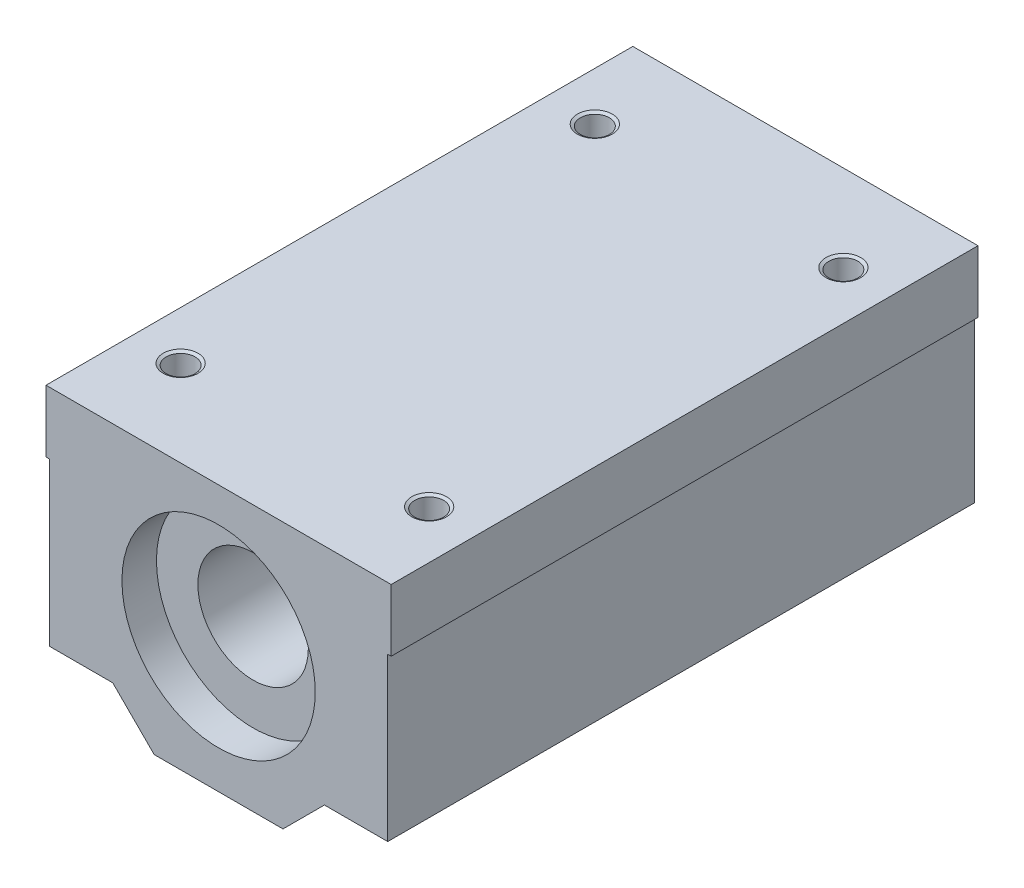
ISO-10303-21;
HEADER;
FILE_DESCRIPTION(('STEP AP214'),'2;1');
FILE_NAME('part.step','',(''),(''),'','','');
FILE_SCHEMA(('AUTOMOTIVE_DESIGN { 1 0 10303 214 1 1 1 1 }'));
ENDSEC;
DATA;
#1=APPLICATION_CONTEXT('core data for automotive mechanical design processes');
#2=APPLICATION_PROTOCOL_DEFINITION('international standard','automotive_design',2000,#1);
#3=PRODUCT_CONTEXT('',#1,'mechanical');
#4=PRODUCT('Part','Part','',(#3));
#5=PRODUCT_RELATED_PRODUCT_CATEGORY('part','',(#4));
#6=PRODUCT_DEFINITION_FORMATION('','',#4);
#7=PRODUCT_DEFINITION_CONTEXT('part definition',#1,'design');
#8=PRODUCT_DEFINITION('design','',#6,#7);
#9=PRODUCT_DEFINITION_SHAPE('','',#8);
#10=(LENGTH_UNIT() NAMED_UNIT(*) SI_UNIT(.MILLI.,.METRE.));
#11=(NAMED_UNIT(*) PLANE_ANGLE_UNIT() SI_UNIT($,.RADIAN.));
#12=(NAMED_UNIT(*) SI_UNIT($,.STERADIAN.) SOLID_ANGLE_UNIT());
#13=UNCERTAINTY_MEASURE_WITH_UNIT(LENGTH_MEASURE(1.E-05),#10,'distance_accuracy_value','');
#14=(GEOMETRIC_REPRESENTATION_CONTEXT(3) GLOBAL_UNCERTAINTY_ASSIGNED_CONTEXT((#13)) GLOBAL_UNIT_ASSIGNED_CONTEXT((#10,
#11,#12)) REPRESENTATION_CONTEXT('',''));
#15=CARTESIAN_POINT('',(0.,0.,0.));
#16=DIRECTION('',(0.,0.,1.));
#17=DIRECTION('',(1.,0.,0.));
#18=AXIS2_PLACEMENT_3D('',#15,#16,#17);
#19=CARTESIAN_POINT('',(0.,0.,85.));
#20=DIRECTION('',(0.,0.,-1.));
#21=DIRECTION('',(-1.,0.,0.));
#22=AXIS2_PLACEMENT_3D('',#19,#20,#21);
#23=CYLINDRICAL_SURFACE('',#22,8.);
#24=CARTESIAN_POINT('',(0.,0.,5.));
#25=DIRECTION('',(0.,0.,-1.));
#26=DIRECTION('',(-1.,0.,0.));
#27=AXIS2_PLACEMENT_3D('',#24,#25,#26);
#28=CIRCLE('',#27,8.);
#29=CARTESIAN_POINT('',(-8.,0.,5.));
#30=VERTEX_POINT('',#29);
#31=EDGE_CURVE('E227',#30,#30,#28,.T.);
#32=ORIENTED_EDGE('',*,*,#31,.T.);
#33=EDGE_LOOP('',(#32));
#34=FACE_BOUND('',#33,.T.);
#35=CARTESIAN_POINT('',(0.,0.,80.));
#36=DIRECTION('',(0.,0.,1.));
#37=DIRECTION('',(1.,0.,0.));
#38=AXIS2_PLACEMENT_3D('',#35,#36,#37);
#39=CIRCLE('',#38,8.);
#40=CARTESIAN_POINT('',(8.,0.,80.));
#41=VERTEX_POINT('',#40);
#42=EDGE_CURVE('E42',#41,#41,#39,.T.);
#43=ORIENTED_EDGE('',*,*,#42,.T.);
#44=EDGE_LOOP('',(#43));
#45=FACE_BOUND('',#44,.T.);
#46=ADVANCED_FACE('F38',(#34,#45),#23,.F.);
#47=CARTESIAN_POINT('',(-18.,19.,12.5));
#48=DIRECTION('',(0.,1.,0.));
#49=DIRECTION('',(0.,0.,1.));
#50=AXIS2_PLACEMENT_3D('',#47,#48,#49);
#51=CYLINDRICAL_SURFACE('',#50,2.1);
#52=CARTESIAN_POINT('',(-18.,18.7546261355944,12.5));
#53=DIRECTION('',(0.,1.,0.));
#54=DIRECTION('',(0.,0.,1.));
#55=AXIS2_PLACEMENT_3D('',#52,#53,#54);
#56=CIRCLE('',#55,2.1);
#57=CARTESIAN_POINT('',(-18.,18.7546261355944,14.6));
#58=VERTEX_POINT('',#57);
#59=EDGE_CURVE('E165',#58,#58,#56,.T.);
#60=ORIENTED_EDGE('',*,*,#59,.T.);
#61=EDGE_LOOP('',(#60));
#62=FACE_BOUND('',#61,.T.);
#63=CARTESIAN_POINT('',(-18.,10.5,12.5));
#64=DIRECTION('',(0.,-1.,0.));
#65=DIRECTION('',(0.,0.,-1.));
#66=AXIS2_PLACEMENT_3D('',#63,#64,#65);
#67=CIRCLE('',#66,2.1);
#68=CARTESIAN_POINT('',(-18.,10.5,10.4));
#69=VERTEX_POINT('',#68);
#70=EDGE_CURVE('E223',#69,#69,#67,.F.);
#71=ORIENTED_EDGE('',*,*,#70,.F.);
#72=EDGE_LOOP('',(#71));
#73=FACE_BOUND('',#72,.T.);
#74=ADVANCED_FACE('F329',(#62,#73),#51,.F.);
#75=CARTESIAN_POINT('',(18.,19.,12.5));
#76=DIRECTION('',(0.,1.,0.));
#77=DIRECTION('',(0.,0.,1.));
#78=AXIS2_PLACEMENT_3D('',#75,#76,#77);
#79=CYLINDRICAL_SURFACE('',#78,2.1);
#80=CARTESIAN_POINT('',(18.,18.7546261355944,12.5));
#81=DIRECTION('',(0.,1.,0.));
#82=DIRECTION('',(0.,0.,1.));
#83=AXIS2_PLACEMENT_3D('',#80,#81,#82);
#84=CIRCLE('',#83,2.1);
#85=CARTESIAN_POINT('',(18.,18.7546261355944,14.6));
#86=VERTEX_POINT('',#85);
#87=EDGE_CURVE('E262',#86,#86,#84,.T.);
#88=ORIENTED_EDGE('',*,*,#87,.T.);
#89=EDGE_LOOP('',(#88));
#90=FACE_BOUND('',#89,.T.);
#91=CARTESIAN_POINT('',(18.,10.5,12.5));
#92=DIRECTION('',(0.,-1.,0.));
#93=DIRECTION('',(0.,0.,-1.));
#94=AXIS2_PLACEMENT_3D('',#91,#92,#93);
#95=CIRCLE('',#94,2.1);
#96=CARTESIAN_POINT('',(18.,10.5,10.4));
#97=VERTEX_POINT('',#96);
#98=EDGE_CURVE('E218',#97,#97,#95,.F.);
#99=ORIENTED_EDGE('',*,*,#98,.F.);
#100=EDGE_LOOP('',(#99));
#101=FACE_BOUND('',#100,.T.);
#102=ADVANCED_FACE('F334',(#90,#101),#79,.F.);
#103=CARTESIAN_POINT('',(18.,19.,72.5));
#104=DIRECTION('',(0.,1.,0.));
#105=DIRECTION('',(0.,0.,1.));
#106=AXIS2_PLACEMENT_3D('',#103,#104,#105);
#107=CYLINDRICAL_SURFACE('',#106,2.1);
#108=CARTESIAN_POINT('',(18.,18.7546261355944,72.5));
#109=DIRECTION('',(0.,1.,0.));
#110=DIRECTION('',(0.,0.,1.));
#111=AXIS2_PLACEMENT_3D('',#108,#109,#110);
#112=CIRCLE('',#111,2.1);
#113=CARTESIAN_POINT('',(18.,18.7546261355944,74.6));
#114=VERTEX_POINT('',#113);
#115=EDGE_CURVE('E268',#114,#114,#112,.T.);
#116=ORIENTED_EDGE('',*,*,#115,.T.);
#117=EDGE_LOOP('',(#116));
#118=FACE_BOUND('',#117,.T.);
#119=CARTESIAN_POINT('',(18.,10.5,72.5));
#120=DIRECTION('',(0.,-1.,0.));
#121=DIRECTION('',(0.,0.,-1.));
#122=AXIS2_PLACEMENT_3D('',#119,#120,#121);
#123=CIRCLE('',#122,2.1);
#124=CARTESIAN_POINT('',(18.,10.5,70.4));
#125=VERTEX_POINT('',#124);
#126=EDGE_CURVE('E213',#125,#125,#123,.F.);
#127=ORIENTED_EDGE('',*,*,#126,.F.);
#128=EDGE_LOOP('',(#127));
#129=FACE_BOUND('',#128,.T.);
#130=ADVANCED_FACE('F402',(#118,#129),#107,.F.);
#131=CARTESIAN_POINT('',(-18.,19.,72.5));
#132=DIRECTION('',(0.,1.,0.));
#133=DIRECTION('',(0.,0.,1.));
#134=AXIS2_PLACEMENT_3D('',#131,#132,#133);
#135=CYLINDRICAL_SURFACE('',#134,2.1);
#136=CARTESIAN_POINT('',(-18.,18.7546261355944,72.5));
#137=DIRECTION('',(0.,1.,0.));
#138=DIRECTION('',(0.,0.,1.));
#139=AXIS2_PLACEMENT_3D('',#136,#137,#138);
#140=CIRCLE('',#139,2.1);
#141=CARTESIAN_POINT('',(-18.,18.7546261355944,74.6));
#142=VERTEX_POINT('',#141);
#143=EDGE_CURVE('E274',#142,#142,#140,.T.);
#144=ORIENTED_EDGE('',*,*,#143,.T.);
#145=EDGE_LOOP('',(#144));
#146=FACE_BOUND('',#145,.T.);
#147=CARTESIAN_POINT('',(-18.,10.5,72.5));
#148=DIRECTION('',(0.,-1.,0.));
#149=DIRECTION('',(0.,0.,-1.));
#150=AXIS2_PLACEMENT_3D('',#147,#148,#149);
#151=CIRCLE('',#150,2.1);
#152=CARTESIAN_POINT('',(-18.,10.5,70.4));
#153=VERTEX_POINT('',#152);
#154=EDGE_CURVE('E208',#153,#153,#151,.F.);
#155=ORIENTED_EDGE('',*,*,#154,.F.);
#156=EDGE_LOOP('',(#155));
#157=FACE_BOUND('',#156,.T.);
#158=ADVANCED_FACE('F340',(#146,#157),#135,.F.);
#159=CARTESIAN_POINT('',(0.,-28.8296389995692,85.));
#160=DIRECTION('',(0.,0.,-1.));
#161=DIRECTION('',(-1.,0.,0.));
#162=AXIS2_PLACEMENT_3D('',#159,#160,#161);
#163=PLANE('',#162);
#164=CARTESIAN_POINT('',(0.,0.,85.));
#165=DIRECTION('',(0.,0.,1.));
#166=DIRECTION('',(1.,0.,0.));
#167=AXIS2_PLACEMENT_3D('',#164,#165,#166);
#168=CIRCLE('',#167,14.);
#169=CARTESIAN_POINT('',(14.,0.,85.));
#170=VERTEX_POINT('',#169);
#171=EDGE_CURVE('E243',#170,#170,#168,.T.);
#172=ORIENTED_EDGE('',*,*,#171,.F.);
#173=EDGE_LOOP('',(#172));
#174=FACE_BOUND('',#173,.T.);
#175=DIRECTION('',(0.707106781186546,-0.707106781186549,0.));
#176=VECTOR('',#175,1.);
#177=CARTESIAN_POINT('',(-15.3296389995691,-13.5,85.));
#178=LINE('',#177,#176);
#179=CARTESIAN_POINT('',(-15.3296389995691,-13.5,85.));
#180=VERTEX_POINT('',#179);
#181=CARTESIAN_POINT('',(-9.32963899956915,-19.5,85.));
#182=VERTEX_POINT('',#181);
#183=EDGE_CURVE('E184',#180,#182,#178,.T.);
#184=ORIENTED_EDGE('',*,*,#183,.T.);
#185=DIRECTION('',(1.,0.,0.));
#186=VECTOR('',#185,1.);
#187=CARTESIAN_POINT('',(9.32963899956915,-19.5,85.));
#188=LINE('',#187,#186);
#189=CARTESIAN_POINT('',(9.32963899956915,-19.5,85.));
#190=VERTEX_POINT('',#189);
#191=EDGE_CURVE('E112',#182,#190,#188,.T.);
#192=ORIENTED_EDGE('',*,*,#191,.T.);
#193=DIRECTION('',(0.707106781186546,0.707106781186549,0.));
#194=VECTOR('',#193,1.);
#195=CARTESIAN_POINT('',(15.3296389995691,-13.5,85.));
#196=LINE('',#195,#194);
#197=CARTESIAN_POINT('',(15.3296389995691,-13.5,85.));
#198=VERTEX_POINT('',#197);
#199=EDGE_CURVE('E284',#190,#198,#196,.T.);
#200=ORIENTED_EDGE('',*,*,#199,.T.);
#201=DIRECTION('',(1.,0.,0.));
#202=VECTOR('',#201,1.);
#203=CARTESIAN_POINT('',(24.5,-13.5,85.));
#204=LINE('',#203,#202);
#205=CARTESIAN_POINT('',(24.5,-13.5,85.));
#206=VERTEX_POINT('',#205);
#207=EDGE_CURVE('E286',#198,#206,#204,.T.);
#208=ORIENTED_EDGE('',*,*,#207,.T.);
#209=DIRECTION('',(0.,1.,0.));
#210=VECTOR('',#209,1.);
#211=CARTESIAN_POINT('',(24.5,10.,85.));
#212=LINE('',#211,#210);
#213=CARTESIAN_POINT('',(24.5,10.,85.));
#214=VERTEX_POINT('',#213);
#215=EDGE_CURVE('E288',#206,#214,#212,.T.);
#216=ORIENTED_EDGE('',*,*,#215,.T.);
#217=DIRECTION('',(1.,0.,0.));
#218=VECTOR('',#217,1.);
#219=CARTESIAN_POINT('',(25.,10.,85.));
#220=LINE('',#219,#218);
#221=CARTESIAN_POINT('',(25.,10.,85.));
#222=VERTEX_POINT('',#221);
#223=EDGE_CURVE('E290',#214,#222,#220,.T.);
#224=ORIENTED_EDGE('',*,*,#223,.T.);
#225=DIRECTION('',(0.,1.,0.));
#226=VECTOR('',#225,1.);
#227=CARTESIAN_POINT('',(25.,19.,85.));
#228=LINE('',#227,#226);
#229=CARTESIAN_POINT('',(25.,19.,85.));
#230=VERTEX_POINT('',#229);
#231=EDGE_CURVE('E292',#222,#230,#228,.T.);
#232=ORIENTED_EDGE('',*,*,#231,.T.);
#233=DIRECTION('',(-1.,0.,0.));
#234=VECTOR('',#233,1.);
#235=CARTESIAN_POINT('',(-25.,19.,85.));
#236=LINE('',#235,#234);
#237=CARTESIAN_POINT('',(-25.,19.,85.));
#238=VERTEX_POINT('',#237);
#239=EDGE_CURVE('E294',#230,#238,#236,.T.);
#240=ORIENTED_EDGE('',*,*,#239,.T.);
#241=DIRECTION('',(0.,-1.,0.));
#242=VECTOR('',#241,1.);
#243=CARTESIAN_POINT('',(-25.,19.,85.));
#244=LINE('',#243,#242);
#245=CARTESIAN_POINT('',(-25.,10.,85.));
#246=VERTEX_POINT('',#245);
#247=EDGE_CURVE('E143',#238,#246,#244,.T.);
#248=ORIENTED_EDGE('',*,*,#247,.T.);
#249=DIRECTION('',(1.,0.,0.));
#250=VECTOR('',#249,1.);
#251=CARTESIAN_POINT('',(-25.,10.,85.));
#252=LINE('',#251,#250);
#253=CARTESIAN_POINT('',(-24.5,10.,85.));
#254=VERTEX_POINT('',#253);
#255=EDGE_CURVE('E137',#246,#254,#252,.T.);
#256=ORIENTED_EDGE('',*,*,#255,.T.);
#257=DIRECTION('',(0.,-1.,0.));
#258=VECTOR('',#257,1.);
#259=CARTESIAN_POINT('',(-24.5,10.,85.));
#260=LINE('',#259,#258);
#261=CARTESIAN_POINT('',(-24.5,-13.5,85.));
#262=VERTEX_POINT('',#261);
#263=EDGE_CURVE('E141',#254,#262,#260,.T.);
#264=ORIENTED_EDGE('',*,*,#263,.T.);
#265=DIRECTION('',(1.,0.,0.));
#266=VECTOR('',#265,1.);
#267=CARTESIAN_POINT('',(-24.5,-13.5,85.));
#268=LINE('',#267,#266);
#269=EDGE_CURVE('E57',#262,#180,#268,.T.);
#270=ORIENTED_EDGE('',*,*,#269,.T.);
#271=EDGE_LOOP('',(#184,#192,#200,#208,#216,#224,#232,#240,#248,#256,#264,#270));
#272=FACE_BOUND('',#271,.T.);
#273=ADVANCED_FACE('F139',(#174,#272),#163,.F.);
#274=CARTESIAN_POINT('',(0.,-28.8296389995692,0.));
#275=DIRECTION('',(0.,0.,-1.));
#276=DIRECTION('',(-1.,0.,0.));
#277=AXIS2_PLACEMENT_3D('',#274,#275,#276);
#278=PLANE('',#277);
#279=CARTESIAN_POINT('',(0.,0.,0.));
#280=DIRECTION('',(0.,0.,-1.));
#281=DIRECTION('',(-1.,0.,0.));
#282=AXIS2_PLACEMENT_3D('',#279,#280,#281);
#283=CIRCLE('',#282,14.);
#284=CARTESIAN_POINT('',(-14.,0.,0.));
#285=VERTEX_POINT('',#284);
#286=EDGE_CURVE('E236',#285,#285,#283,.T.);
#287=ORIENTED_EDGE('',*,*,#286,.F.);
#288=EDGE_LOOP('',(#287));
#289=FACE_BOUND('',#288,.T.);
#290=DIRECTION('',(0.707106781186546,-0.707106781186549,0.));
#291=VECTOR('',#290,1.);
#292=CARTESIAN_POINT('',(-15.3296389995691,-13.5,0.));
#293=LINE('',#292,#291);
#294=CARTESIAN_POINT('',(-15.3296389995691,-13.5,0.));
#295=VERTEX_POINT('',#294);
#296=CARTESIAN_POINT('',(-9.32963899956915,-19.5,0.));
#297=VERTEX_POINT('',#296);
#298=EDGE_CURVE('E161',#295,#297,#293,.T.);
#299=ORIENTED_EDGE('',*,*,#298,.F.);
#300=DIRECTION('',(1.,0.,0.));
#301=VECTOR('',#300,1.);
#302=CARTESIAN_POINT('',(-24.5,-13.5,0.));
#303=LINE('',#302,#301);
#304=CARTESIAN_POINT('',(-24.5,-13.5,0.));
#305=VERTEX_POINT('',#304);
#306=EDGE_CURVE('E104',#305,#295,#303,.T.);
#307=ORIENTED_EDGE('',*,*,#306,.F.);
#308=DIRECTION('',(0.,-1.,0.));
#309=VECTOR('',#308,1.);
#310=CARTESIAN_POINT('',(-24.5,10.,0.));
#311=LINE('',#310,#309);
#312=CARTESIAN_POINT('',(-24.5,10.,0.));
#313=VERTEX_POINT('',#312);
#314=EDGE_CURVE('E98',#313,#305,#311,.T.);
#315=ORIENTED_EDGE('',*,*,#314,.F.);
#316=DIRECTION('',(1.,0.,0.));
#317=VECTOR('',#316,1.);
#318=CARTESIAN_POINT('',(-25.,10.,0.));
#319=LINE('',#318,#317);
#320=CARTESIAN_POINT('',(-25.,10.,0.));
#321=VERTEX_POINT('',#320);
#322=EDGE_CURVE('E151',#321,#313,#319,.T.);
#323=ORIENTED_EDGE('',*,*,#322,.F.);
#324=DIRECTION('',(0.,-1.,0.));
#325=VECTOR('',#324,1.);
#326=CARTESIAN_POINT('',(-25.,19.,0.));
#327=LINE('',#326,#325);
#328=CARTESIAN_POINT('',(-25.,19.,0.));
#329=VERTEX_POINT('',#328);
#330=EDGE_CURVE('E179',#329,#321,#327,.T.);
#331=ORIENTED_EDGE('',*,*,#330,.F.);
#332=DIRECTION('',(-1.,0.,0.));
#333=VECTOR('',#332,1.);
#334=CARTESIAN_POINT('',(-25.,19.,0.));
#335=LINE('',#334,#333);
#336=CARTESIAN_POINT('',(25.,19.,0.));
#337=VERTEX_POINT('',#336);
#338=EDGE_CURVE('E177',#337,#329,#335,.T.);
#339=ORIENTED_EDGE('',*,*,#338,.F.);
#340=DIRECTION('',(0.,1.,0.));
#341=VECTOR('',#340,1.);
#342=CARTESIAN_POINT('',(25.,19.,0.));
#343=LINE('',#342,#341);
#344=CARTESIAN_POINT('',(25.,10.,0.));
#345=VERTEX_POINT('',#344);
#346=EDGE_CURVE('E175',#345,#337,#343,.T.);
#347=ORIENTED_EDGE('',*,*,#346,.F.);
#348=DIRECTION('',(1.,0.,0.));
#349=VECTOR('',#348,1.);
#350=CARTESIAN_POINT('',(25.,10.,0.));
#351=LINE('',#350,#349);
#352=CARTESIAN_POINT('',(24.5,10.,0.));
#353=VERTEX_POINT('',#352);
#354=EDGE_CURVE('E173',#353,#345,#351,.T.);
#355=ORIENTED_EDGE('',*,*,#354,.F.);
#356=DIRECTION('',(0.,1.,0.));
#357=VECTOR('',#356,1.);
#358=CARTESIAN_POINT('',(24.5,10.,0.));
#359=LINE('',#358,#357);
#360=CARTESIAN_POINT('',(24.5,-13.5,0.));
#361=VERTEX_POINT('',#360);
#362=EDGE_CURVE('E171',#361,#353,#359,.T.);
#363=ORIENTED_EDGE('',*,*,#362,.F.);
#364=DIRECTION('',(1.,0.,0.));
#365=VECTOR('',#364,1.);
#366=CARTESIAN_POINT('',(24.5,-13.5,0.));
#367=LINE('',#366,#365);
#368=CARTESIAN_POINT('',(15.3296389995691,-13.5,0.));
#369=VERTEX_POINT('',#368);
#370=EDGE_CURVE('E169',#369,#361,#367,.T.);
#371=ORIENTED_EDGE('',*,*,#370,.F.);
#372=DIRECTION('',(0.707106781186546,0.707106781186549,0.));
#373=VECTOR('',#372,1.);
#374=CARTESIAN_POINT('',(15.3296389995691,-13.5,0.));
#375=LINE('',#374,#373);
#376=CARTESIAN_POINT('',(9.32963899956915,-19.5,0.));
#377=VERTEX_POINT('',#376);
#378=EDGE_CURVE('E167',#377,#369,#375,.T.);
#379=ORIENTED_EDGE('',*,*,#378,.F.);
#380=DIRECTION('',(1.,0.,0.));
#381=VECTOR('',#380,1.);
#382=CARTESIAN_POINT('',(9.32963899956915,-19.5,0.));
#383=LINE('',#382,#381);
#384=EDGE_CURVE('E164',#297,#377,#383,.T.);
#385=ORIENTED_EDGE('',*,*,#384,.F.);
#386=EDGE_LOOP('',(#299,#307,#315,#323,#331,#339,#347,#355,#363,#371,#379,#385));
#387=FACE_BOUND('',#386,.T.);
#388=ADVANCED_FACE('F307',(#289,#387),#278,.T.);
#389=CARTESIAN_POINT('',(-15.3296389995691,-13.5,85.));
#390=DIRECTION('',(0.707106781186549,0.707106781186546,0.));
#391=DIRECTION('',(-0.707106781186546,0.707106781186549,0.));
#392=AXIS2_PLACEMENT_3D('',#389,#390,#391);
#393=PLANE('',#392);
#394=ORIENTED_EDGE('',*,*,#298,.T.);
#395=DIRECTION('',(0.,0.,-1.));
#396=VECTOR('',#395,1.);
#397=CARTESIAN_POINT('',(-9.32963899956915,-19.5,85.));
#398=LINE('',#397,#396);
#399=EDGE_CURVE('E11',#182,#297,#398,.T.);
#400=ORIENTED_EDGE('',*,*,#399,.F.);
#401=ORIENTED_EDGE('',*,*,#183,.F.);
#402=DIRECTION('',(0.,0.,-1.));
#403=VECTOR('',#402,1.);
#404=CARTESIAN_POINT('',(-15.3296389995691,-13.5,85.));
#405=LINE('',#404,#403);
#406=EDGE_CURVE('E157',#180,#295,#405,.T.);
#407=ORIENTED_EDGE('',*,*,#406,.T.);
#408=EDGE_LOOP('',(#394,#400,#401,#407));
#409=FACE_BOUND('',#408,.T.);
#410=ADVANCED_FACE('F40',(#409),#393,.F.);
#411=CARTESIAN_POINT('',(9.32963899956915,-19.5,85.));
#412=DIRECTION('',(0.,1.,0.));
#413=DIRECTION('',(0.,0.,1.));
#414=AXIS2_PLACEMENT_3D('',#411,#412,#413);
#415=PLANE('',#414);
#416=ORIENTED_EDGE('',*,*,#384,.T.);
#417=DIRECTION('',(0.,0.,-1.));
#418=VECTOR('',#417,1.);
#419=CARTESIAN_POINT('',(9.32963899956915,-19.5,85.));
#420=LINE('',#419,#418);
#421=EDGE_CURVE('E48',#190,#377,#420,.T.);
#422=ORIENTED_EDGE('',*,*,#421,.F.);
#423=ORIENTED_EDGE('',*,*,#191,.F.);
#424=ORIENTED_EDGE('',*,*,#399,.T.);
#425=EDGE_LOOP('',(#416,#422,#423,#424));
#426=FACE_BOUND('',#425,.T.);
#427=ADVANCED_FACE('F347',(#426),#415,.F.);
#428=CARTESIAN_POINT('',(15.3296389995691,-13.5,85.));
#429=DIRECTION('',(-0.707106781186549,0.707106781186546,0.));
#430=DIRECTION('',(-0.707106781186546,-0.707106781186549,0.));
#431=AXIS2_PLACEMENT_3D('',#428,#429,#430);
#432=PLANE('',#431);
#433=ORIENTED_EDGE('',*,*,#378,.T.);
#434=DIRECTION('',(0.,0.,-1.));
#435=VECTOR('',#434,1.);
#436=CARTESIAN_POINT('',(15.3296389995691,-13.5,85.));
#437=LINE('',#436,#435);
#438=EDGE_CURVE('E203',#198,#369,#437,.T.);
#439=ORIENTED_EDGE('',*,*,#438,.F.);
#440=ORIENTED_EDGE('',*,*,#199,.F.);
#441=ORIENTED_EDGE('',*,*,#421,.T.);
#442=EDGE_LOOP('',(#433,#439,#440,#441));
#443=FACE_BOUND('',#442,.T.);
#444=ADVANCED_FACE('F453',(#443),#432,.F.);
#445=CARTESIAN_POINT('',(24.5,-13.5,85.));
#446=DIRECTION('',(0.,1.,0.));
#447=DIRECTION('',(0.,0.,1.));
#448=AXIS2_PLACEMENT_3D('',#445,#446,#447);
#449=PLANE('',#448);
#450=CARTESIAN_POINT('',(18.,-13.5,12.5));
#451=DIRECTION('',(0.,-1.,0.));
#452=DIRECTION('',(0.,0.,-1.));
#453=AXIS2_PLACEMENT_3D('',#450,#451,#452);
#454=CIRCLE('',#453,2.15);
#455=CARTESIAN_POINT('',(18.,-13.5,10.35));
#456=VERTEX_POINT('',#455);
#457=EDGE_CURVE('E225',#456,#456,#454,.T.);
#458=ORIENTED_EDGE('',*,*,#457,.F.);
#459=EDGE_LOOP('',(#458));
#460=FACE_BOUND('',#459,.T.);
#461=CARTESIAN_POINT('',(18.,-13.5,72.5));
#462=DIRECTION('',(0.,-1.,0.));
#463=DIRECTION('',(0.,0.,-1.));
#464=AXIS2_PLACEMENT_3D('',#461,#462,#463);
#465=CIRCLE('',#464,2.15);
#466=CARTESIAN_POINT('',(18.,-13.5,70.35));
#467=VERTEX_POINT('',#466);
#468=EDGE_CURVE('E221',#467,#467,#465,.T.);
#469=ORIENTED_EDGE('',*,*,#468,.F.);
#470=EDGE_LOOP('',(#469));
#471=FACE_BOUND('',#470,.T.);
#472=ORIENTED_EDGE('',*,*,#370,.T.);
#473=DIRECTION('',(0.,0.,-1.));
#474=VECTOR('',#473,1.);
#475=CARTESIAN_POINT('',(24.5,-13.5,85.));
#476=LINE('',#475,#474);
#477=EDGE_CURVE('E200',#206,#361,#476,.T.);
#478=ORIENTED_EDGE('',*,*,#477,.F.);
#479=ORIENTED_EDGE('',*,*,#207,.F.);
#480=ORIENTED_EDGE('',*,*,#438,.T.);
#481=EDGE_LOOP('',(#472,#478,#479,#480));
#482=FACE_BOUND('',#481,.T.);
#483=ADVANCED_FACE('F449',(#460,#471,#482),#449,.F.);
#484=CARTESIAN_POINT('',(24.5,10.,85.));
#485=DIRECTION('',(-1.,0.,0.));
#486=DIRECTION('',(0.,-1.,0.));
#487=AXIS2_PLACEMENT_3D('',#484,#485,#486);
#488=PLANE('',#487);
#489=ORIENTED_EDGE('',*,*,#362,.T.);
#490=DIRECTION('',(0.,0.,-1.));
#491=VECTOR('',#490,1.);
#492=CARTESIAN_POINT('',(24.5,10.,85.));
#493=LINE('',#492,#491);
#494=EDGE_CURVE('E197',#214,#353,#493,.T.);
#495=ORIENTED_EDGE('',*,*,#494,.F.);
#496=ORIENTED_EDGE('',*,*,#215,.F.);
#497=ORIENTED_EDGE('',*,*,#477,.T.);
#498=EDGE_LOOP('',(#489,#495,#496,#497));
#499=FACE_BOUND('',#498,.T.);
#500=ADVANCED_FACE('F445',(#499),#488,.F.);
#501=CARTESIAN_POINT('',(25.,10.,85.));
#502=DIRECTION('',(0.,1.,0.));
#503=DIRECTION('',(-1.,0.,0.));
#504=AXIS2_PLACEMENT_3D('',#501,#502,#503);
#505=PLANE('',#504);
#506=ORIENTED_EDGE('',*,*,#354,.T.);
#507=DIRECTION('',(0.,0.,-1.));
#508=VECTOR('',#507,1.);
#509=CARTESIAN_POINT('',(25.,10.,85.));
#510=LINE('',#509,#508);
#511=EDGE_CURVE('E194',#222,#345,#510,.T.);
#512=ORIENTED_EDGE('',*,*,#511,.F.);
#513=ORIENTED_EDGE('',*,*,#223,.F.);
#514=ORIENTED_EDGE('',*,*,#494,.T.);
#515=EDGE_LOOP('',(#506,#512,#513,#514));
#516=FACE_BOUND('',#515,.T.);
#517=ADVANCED_FACE('F436',(#516),#505,.F.);
#518=CARTESIAN_POINT('',(25.,19.,85.));
#519=DIRECTION('',(-1.,0.,0.));
#520=DIRECTION('',(0.,-1.,0.));
#521=AXIS2_PLACEMENT_3D('',#518,#519,#520);
#522=PLANE('',#521);
#523=ORIENTED_EDGE('',*,*,#346,.T.);
#524=DIRECTION('',(0.,0.,-1.));
#525=VECTOR('',#524,1.);
#526=CARTESIAN_POINT('',(25.,19.,85.));
#527=LINE('',#526,#525);
#528=EDGE_CURVE('E191',#230,#337,#527,.T.);
#529=ORIENTED_EDGE('',*,*,#528,.F.);
#530=ORIENTED_EDGE('',*,*,#231,.F.);
#531=ORIENTED_EDGE('',*,*,#511,.T.);
#532=EDGE_LOOP('',(#523,#529,#530,#531));
#533=FACE_BOUND('',#532,.T.);
#534=ADVANCED_FACE('F426',(#533),#522,.F.);
#535=CARTESIAN_POINT('',(-25.,19.,85.));
#536=DIRECTION('',(0.,-1.,0.));
#537=DIRECTION('',(0.,0.,-1.));
#538=AXIS2_PLACEMENT_3D('',#535,#536,#537);
#539=PLANE('',#538);
#540=CARTESIAN_POINT('',(18.,19.,12.5));
#541=DIRECTION('',(0.,1.,0.));
#542=DIRECTION('',(0.,0.,1.));
#543=AXIS2_PLACEMENT_3D('',#540,#541,#542);
#544=CIRCLE('',#543,2.525);
#545=CARTESIAN_POINT('',(18.,19.,15.025));
#546=VERTEX_POINT('',#545);
#547=EDGE_CURVE('E211',#546,#546,#544,.T.);
#548=ORIENTED_EDGE('',*,*,#547,.F.);
#549=EDGE_LOOP('',(#548));
#550=FACE_BOUND('',#549,.T.);
#551=CARTESIAN_POINT('',(18.,19.,72.5));
#552=DIRECTION('',(0.,1.,0.));
#553=DIRECTION('',(0.,0.,1.));
#554=AXIS2_PLACEMENT_3D('',#551,#552,#553);
#555=CIRCLE('',#554,2.525);
#556=CARTESIAN_POINT('',(18.,19.,75.025));
#557=VERTEX_POINT('',#556);
#558=EDGE_CURVE('E265',#557,#557,#555,.T.);
#559=ORIENTED_EDGE('',*,*,#558,.F.);
#560=EDGE_LOOP('',(#559));
#561=FACE_BOUND('',#560,.T.);
#562=CARTESIAN_POINT('',(-18.,19.,72.5));
#563=DIRECTION('',(0.,1.,0.));
#564=DIRECTION('',(0.,0.,1.));
#565=AXIS2_PLACEMENT_3D('',#562,#563,#564);
#566=CIRCLE('',#565,2.525);
#567=CARTESIAN_POINT('',(-18.,19.,75.025));
#568=VERTEX_POINT('',#567);
#569=EDGE_CURVE('E271',#568,#568,#566,.T.);
#570=ORIENTED_EDGE('',*,*,#569,.F.);
#571=EDGE_LOOP('',(#570));
#572=FACE_BOUND('',#571,.T.);
#573=CARTESIAN_POINT('',(-18.,19.,12.5));
#574=DIRECTION('',(0.,1.,0.));
#575=DIRECTION('',(0.,0.,1.));
#576=AXIS2_PLACEMENT_3D('',#573,#574,#575);
#577=CIRCLE('',#576,2.525);
#578=CARTESIAN_POINT('',(-18.,19.,15.025));
#579=VERTEX_POINT('',#578);
#580=EDGE_CURVE('E277',#579,#579,#577,.T.);
#581=ORIENTED_EDGE('',*,*,#580,.F.);
#582=EDGE_LOOP('',(#581));
#583=FACE_BOUND('',#582,.T.);
#584=ORIENTED_EDGE('',*,*,#338,.T.);
#585=DIRECTION('',(0.,0.,-1.));
#586=VECTOR('',#585,1.);
#587=CARTESIAN_POINT('',(-25.,19.,85.));
#588=LINE('',#587,#586);
#589=EDGE_CURVE('E188',#238,#329,#588,.T.);
#590=ORIENTED_EDGE('',*,*,#589,.F.);
#591=ORIENTED_EDGE('',*,*,#239,.F.);
#592=ORIENTED_EDGE('',*,*,#528,.T.);
#593=EDGE_LOOP('',(#584,#590,#591,#592));
#594=FACE_BOUND('',#593,.T.);
#595=ADVANCED_FACE('F300',(#550,#561,#572,#583,#594),#539,.F.);
#596=CARTESIAN_POINT('',(-25.,19.,85.));
#597=DIRECTION('',(1.,0.,0.));
#598=DIRECTION('',(0.,1.,0.));
#599=AXIS2_PLACEMENT_3D('',#596,#597,#598);
#600=PLANE('',#599);
#601=ORIENTED_EDGE('',*,*,#330,.T.);
#602=DIRECTION('',(0.,0.,-1.));
#603=VECTOR('',#602,1.);
#604=CARTESIAN_POINT('',(-25.,10.,85.));
#605=LINE('',#604,#603);
#606=EDGE_CURVE('E152',#246,#321,#605,.T.);
#607=ORIENTED_EDGE('',*,*,#606,.F.);
#608=ORIENTED_EDGE('',*,*,#247,.F.);
#609=ORIENTED_EDGE('',*,*,#589,.T.);
#610=EDGE_LOOP('',(#601,#607,#608,#609));
#611=FACE_BOUND('',#610,.T.);
#612=ADVANCED_FACE('F304',(#611),#600,.F.);
#613=CARTESIAN_POINT('',(-25.,10.,85.));
#614=DIRECTION('',(0.,1.,0.));
#615=DIRECTION('',(-1.,0.,0.));
#616=AXIS2_PLACEMENT_3D('',#613,#614,#615);
#617=PLANE('',#616);
#618=ORIENTED_EDGE('',*,*,#322,.T.);
#619=DIRECTION('',(0.,0.,-1.));
#620=VECTOR('',#619,1.);
#621=CARTESIAN_POINT('',(-24.5,10.,85.));
#622=LINE('',#621,#620);
#623=EDGE_CURVE('E148',#254,#313,#622,.T.);
#624=ORIENTED_EDGE('',*,*,#623,.F.);
#625=ORIENTED_EDGE('',*,*,#255,.F.);
#626=ORIENTED_EDGE('',*,*,#606,.T.);
#627=EDGE_LOOP('',(#618,#624,#625,#626));
#628=FACE_BOUND('',#627,.T.);
#629=ADVANCED_FACE('F149',(#628),#617,.F.);
#630=CARTESIAN_POINT('',(-24.5,10.,85.));
#631=DIRECTION('',(1.,0.,0.));
#632=DIRECTION('',(0.,1.,0.));
#633=AXIS2_PLACEMENT_3D('',#630,#631,#632);
#634=PLANE('',#633);
#635=ORIENTED_EDGE('',*,*,#314,.T.);
#636=DIRECTION('',(0.,0.,-1.));
#637=VECTOR('',#636,1.);
#638=CARTESIAN_POINT('',(-24.5,-13.5,85.));
#639=LINE('',#638,#637);
#640=EDGE_CURVE('E153',#262,#305,#639,.T.);
#641=ORIENTED_EDGE('',*,*,#640,.F.);
#642=ORIENTED_EDGE('',*,*,#263,.F.);
#643=ORIENTED_EDGE('',*,*,#623,.T.);
#644=EDGE_LOOP('',(#635,#641,#642,#643));
#645=FACE_BOUND('',#644,.T.);
#646=ADVANCED_FACE('F155',(#645),#634,.F.);
#647=CARTESIAN_POINT('',(-24.5,-13.5,85.));
#648=DIRECTION('',(0.,1.,0.));
#649=DIRECTION('',(0.,0.,1.));
#650=AXIS2_PLACEMENT_3D('',#647,#648,#649);
#651=PLANE('',#650);
#652=CARTESIAN_POINT('',(-18.,-13.5,12.5));
#653=DIRECTION('',(0.,-1.,0.));
#654=DIRECTION('',(0.,0.,-1.));
#655=AXIS2_PLACEMENT_3D('',#652,#653,#654);
#656=CIRCLE('',#655,2.15);
#657=CARTESIAN_POINT('',(-18.,-13.5,10.35));
#658=VERTEX_POINT('',#657);
#659=EDGE_CURVE('E229',#658,#658,#656,.T.);
#660=ORIENTED_EDGE('',*,*,#659,.F.);
#661=EDGE_LOOP('',(#660));
#662=FACE_BOUND('',#661,.T.);
#663=CARTESIAN_POINT('',(-18.,-13.5,72.5));
#664=DIRECTION('',(0.,-1.,0.));
#665=DIRECTION('',(0.,0.,-1.));
#666=AXIS2_PLACEMENT_3D('',#663,#664,#665);
#667=CIRCLE('',#666,2.15);
#668=CARTESIAN_POINT('',(-18.,-13.5,70.35));
#669=VERTEX_POINT('',#668);
#670=EDGE_CURVE('E216',#669,#669,#667,.T.);
#671=ORIENTED_EDGE('',*,*,#670,.F.);
#672=EDGE_LOOP('',(#671));
#673=FACE_BOUND('',#672,.T.);
#674=ORIENTED_EDGE('',*,*,#306,.T.);
#675=ORIENTED_EDGE('',*,*,#406,.F.);
#676=ORIENTED_EDGE('',*,*,#269,.F.);
#677=ORIENTED_EDGE('',*,*,#640,.T.);
#678=EDGE_LOOP('',(#674,#675,#676,#677));
#679=FACE_BOUND('',#678,.T.);
#680=ADVANCED_FACE('F312',(#662,#673,#679),#651,.F.);
#681=CARTESIAN_POINT('',(-18.,19.,12.5));
#682=DIRECTION('',(0.,1.,0.));
#683=DIRECTION('',(0.,0.,1.));
#684=AXIS2_PLACEMENT_3D('',#681,#682,#683);
#685=CONICAL_SURFACE('',#684,2.525,1.0471975511966);
#686=ORIENTED_EDGE('',*,*,#59,.F.);
#687=EDGE_LOOP('',(#686));
#688=FACE_BOUND('',#687,.T.);
#689=ORIENTED_EDGE('',*,*,#580,.T.);
#690=EDGE_LOOP('',(#689));
#691=FACE_BOUND('',#690,.T.);
#692=ADVANCED_FACE('F314',(#688,#691),#685,.F.);
#693=CARTESIAN_POINT('',(-18.,19.,72.5));
#694=DIRECTION('',(0.,1.,0.));
#695=DIRECTION('',(0.,0.,1.));
#696=AXIS2_PLACEMENT_3D('',#693,#694,#695);
#697=CONICAL_SURFACE('',#696,2.525,1.0471975511966);
#698=ORIENTED_EDGE('',*,*,#143,.F.);
#699=EDGE_LOOP('',(#698));
#700=FACE_BOUND('',#699,.T.);
#701=ORIENTED_EDGE('',*,*,#569,.T.);
#702=EDGE_LOOP('',(#701));
#703=FACE_BOUND('',#702,.T.);
#704=ADVANCED_FACE('F321',(#700,#703),#697,.F.);
#705=CARTESIAN_POINT('',(18.,19.,72.5));
#706=DIRECTION('',(0.,1.,0.));
#707=DIRECTION('',(0.,0.,1.));
#708=AXIS2_PLACEMENT_3D('',#705,#706,#707);
#709=CONICAL_SURFACE('',#708,2.525,1.0471975511966);
#710=ORIENTED_EDGE('',*,*,#115,.F.);
#711=EDGE_LOOP('',(#710));
#712=FACE_BOUND('',#711,.T.);
#713=ORIENTED_EDGE('',*,*,#558,.T.);
#714=EDGE_LOOP('',(#713));
#715=FACE_BOUND('',#714,.T.);
#716=ADVANCED_FACE('F398',(#712,#715),#709,.F.);
#717=CARTESIAN_POINT('',(18.,19.,12.5));
#718=DIRECTION('',(0.,1.,0.));
#719=DIRECTION('',(0.,0.,1.));
#720=AXIS2_PLACEMENT_3D('',#717,#718,#719);
#721=CONICAL_SURFACE('',#720,2.525,1.0471975511966);
#722=ORIENTED_EDGE('',*,*,#87,.F.);
#723=EDGE_LOOP('',(#722));
#724=FACE_BOUND('',#723,.T.);
#725=ORIENTED_EDGE('',*,*,#547,.T.);
#726=EDGE_LOOP('',(#725));
#727=FACE_BOUND('',#726,.T.);
#728=ADVANCED_FACE('F391',(#724,#727),#721,.F.);
#729=CARTESIAN_POINT('',(-18.,10.5,72.5));
#730=DIRECTION('',(0.,-1.,0.));
#731=DIRECTION('',(0.,0.,-1.));
#732=AXIS2_PLACEMENT_3D('',#729,#730,#731);
#733=PLANE('',#732);
#734=CARTESIAN_POINT('',(-18.,10.5,72.5));
#735=DIRECTION('',(0.,-1.,0.));
#736=DIRECTION('',(0.,0.,-1.));
#737=AXIS2_PLACEMENT_3D('',#734,#735,#736);
#738=CIRCLE('',#737,2.15);
#739=CARTESIAN_POINT('',(-18.,10.5,70.35));
#740=VERTEX_POINT('',#739);
#741=EDGE_CURVE('E212',#740,#740,#738,.T.);
#742=ORIENTED_EDGE('',*,*,#741,.T.);
#743=EDGE_LOOP('',(#742));
#744=FACE_BOUND('',#743,.T.);
#745=ORIENTED_EDGE('',*,*,#154,.T.);
#746=EDGE_LOOP('',(#745));
#747=FACE_BOUND('',#746,.T.);
#748=ADVANCED_FACE('F388',(#744,#747),#733,.T.);
#749=CARTESIAN_POINT('',(-18.,10.5,72.5));
#750=DIRECTION('',(0.,-1.,0.));
#751=DIRECTION('',(0.,0.,-1.));
#752=AXIS2_PLACEMENT_3D('',#749,#750,#751);
#753=CYLINDRICAL_SURFACE('',#752,2.15);
#754=ORIENTED_EDGE('',*,*,#741,.F.);
#755=EDGE_LOOP('',(#754));
#756=FACE_BOUND('',#755,.T.);
#757=ORIENTED_EDGE('',*,*,#670,.T.);
#758=EDGE_LOOP('',(#757));
#759=FACE_BOUND('',#758,.T.);
#760=ADVANCED_FACE('F383',(#756,#759),#753,.F.);
#761=CARTESIAN_POINT('',(18.,10.5,72.5));
#762=DIRECTION('',(0.,-1.,0.));
#763=DIRECTION('',(0.,0.,-1.));
#764=AXIS2_PLACEMENT_3D('',#761,#762,#763);
#765=PLANE('',#764);
#766=CARTESIAN_POINT('',(18.,10.5,72.5));
#767=DIRECTION('',(0.,-1.,0.));
#768=DIRECTION('',(0.,0.,-1.));
#769=AXIS2_PLACEMENT_3D('',#766,#767,#768);
#770=CIRCLE('',#769,2.15);
#771=CARTESIAN_POINT('',(18.,10.5,70.35));
#772=VERTEX_POINT('',#771);
#773=EDGE_CURVE('E217',#772,#772,#770,.T.);
#774=ORIENTED_EDGE('',*,*,#773,.T.);
#775=EDGE_LOOP('',(#774));
#776=FACE_BOUND('',#775,.T.);
#777=ORIENTED_EDGE('',*,*,#126,.T.);
#778=EDGE_LOOP('',(#777));
#779=FACE_BOUND('',#778,.T.);
#780=ADVANCED_FACE('F380',(#776,#779),#765,.T.);
#781=CARTESIAN_POINT('',(18.,10.5,72.5));
#782=DIRECTION('',(0.,-1.,0.));
#783=DIRECTION('',(0.,0.,-1.));
#784=AXIS2_PLACEMENT_3D('',#781,#782,#783);
#785=CYLINDRICAL_SURFACE('',#784,2.15);
#786=ORIENTED_EDGE('',*,*,#773,.F.);
#787=EDGE_LOOP('',(#786));
#788=FACE_BOUND('',#787,.T.);
#789=ORIENTED_EDGE('',*,*,#468,.T.);
#790=EDGE_LOOP('',(#789));
#791=FACE_BOUND('',#790,.T.);
#792=ADVANCED_FACE('F375',(#788,#791),#785,.F.);
#793=CARTESIAN_POINT('',(18.,10.5,12.5));
#794=DIRECTION('',(0.,-1.,0.));
#795=DIRECTION('',(0.,0.,-1.));
#796=AXIS2_PLACEMENT_3D('',#793,#794,#795);
#797=PLANE('',#796);
#798=CARTESIAN_POINT('',(18.,10.5,12.5));
#799=DIRECTION('',(0.,-1.,0.));
#800=DIRECTION('',(0.,0.,-1.));
#801=AXIS2_PLACEMENT_3D('',#798,#799,#800);
#802=CIRCLE('',#801,2.15);
#803=CARTESIAN_POINT('',(18.,10.5,10.35));
#804=VERTEX_POINT('',#803);
#805=EDGE_CURVE('E222',#804,#804,#802,.T.);
#806=ORIENTED_EDGE('',*,*,#805,.T.);
#807=EDGE_LOOP('',(#806));
#808=FACE_BOUND('',#807,.T.);
#809=ORIENTED_EDGE('',*,*,#98,.T.);
#810=EDGE_LOOP('',(#809));
#811=FACE_BOUND('',#810,.T.);
#812=ADVANCED_FACE('F372',(#808,#811),#797,.T.);
#813=CARTESIAN_POINT('',(18.,10.5,12.5));
#814=DIRECTION('',(0.,-1.,0.));
#815=DIRECTION('',(0.,0.,-1.));
#816=AXIS2_PLACEMENT_3D('',#813,#814,#815);
#817=CYLINDRICAL_SURFACE('',#816,2.15);
#818=ORIENTED_EDGE('',*,*,#805,.F.);
#819=EDGE_LOOP('',(#818));
#820=FACE_BOUND('',#819,.T.);
#821=ORIENTED_EDGE('',*,*,#457,.T.);
#822=EDGE_LOOP('',(#821));
#823=FACE_BOUND('',#822,.T.);
#824=ADVANCED_FACE('F369',(#820,#823),#817,.F.);
#825=CARTESIAN_POINT('',(-18.,10.5,12.5));
#826=DIRECTION('',(0.,-1.,0.));
#827=DIRECTION('',(0.,0.,-1.));
#828=AXIS2_PLACEMENT_3D('',#825,#826,#827);
#829=PLANE('',#828);
#830=CARTESIAN_POINT('',(-18.,10.5,12.5));
#831=DIRECTION('',(0.,-1.,0.));
#832=DIRECTION('',(0.,0.,-1.));
#833=AXIS2_PLACEMENT_3D('',#830,#831,#832);
#834=CIRCLE('',#833,2.15);
#835=CARTESIAN_POINT('',(-18.,10.5,10.35));
#836=VERTEX_POINT('',#835);
#837=EDGE_CURVE('E226',#836,#836,#834,.T.);
#838=ORIENTED_EDGE('',*,*,#837,.T.);
#839=EDGE_LOOP('',(#838));
#840=FACE_BOUND('',#839,.T.);
#841=ORIENTED_EDGE('',*,*,#70,.T.);
#842=EDGE_LOOP('',(#841));
#843=FACE_BOUND('',#842,.T.);
#844=ADVANCED_FACE('F363',(#840,#843),#829,.T.);
#845=CARTESIAN_POINT('',(-18.,10.5,12.5));
#846=DIRECTION('',(0.,-1.,0.));
#847=DIRECTION('',(0.,0.,-1.));
#848=AXIS2_PLACEMENT_3D('',#845,#846,#847);
#849=CYLINDRICAL_SURFACE('',#848,2.15);
#850=ORIENTED_EDGE('',*,*,#837,.F.);
#851=EDGE_LOOP('',(#850));
#852=FACE_BOUND('',#851,.T.);
#853=ORIENTED_EDGE('',*,*,#659,.T.);
#854=EDGE_LOOP('',(#853));
#855=FACE_BOUND('',#854,.T.);
#856=ADVANCED_FACE('F353',(#852,#855),#849,.F.);
#857=CARTESIAN_POINT('',(0.,0.,5.));
#858=DIRECTION('',(0.,0.,-1.));
#859=DIRECTION('',(-1.,0.,0.));
#860=AXIS2_PLACEMENT_3D('',#857,#858,#859);
#861=CYLINDRICAL_SURFACE('',#860,14.);
#862=CARTESIAN_POINT('',(0.,0.,5.));
#863=DIRECTION('',(0.,0.,-1.));
#864=DIRECTION('',(-1.,0.,0.));
#865=AXIS2_PLACEMENT_3D('',#862,#863,#864);
#866=CIRCLE('',#865,14.);
#867=CARTESIAN_POINT('',(-14.,0.,5.));
#868=VERTEX_POINT('',#867);
#869=EDGE_CURVE('E230',#868,#868,#866,.T.);
#870=ORIENTED_EDGE('',*,*,#869,.F.);
#871=EDGE_LOOP('',(#870));
#872=FACE_BOUND('',#871,.T.);
#873=ORIENTED_EDGE('',*,*,#286,.T.);
#874=EDGE_LOOP('',(#873));
#875=FACE_BOUND('',#874,.T.);
#876=ADVANCED_FACE('F350',(#872,#875),#861,.F.);
#877=CARTESIAN_POINT('',(0.,0.,5.));
#878=DIRECTION('',(0.,0.,-1.));
#879=DIRECTION('',(-1.,0.,0.));
#880=AXIS2_PLACEMENT_3D('',#877,#878,#879);
#881=PLANE('',#880);
#882=ORIENTED_EDGE('',*,*,#31,.F.);
#883=EDGE_LOOP('',(#882));
#884=FACE_BOUND('',#883,.T.);
#885=ORIENTED_EDGE('',*,*,#869,.T.);
#886=EDGE_LOOP('',(#885));
#887=FACE_BOUND('',#886,.T.);
#888=ADVANCED_FACE('F352',(#884,#887),#881,.T.);
#889=CARTESIAN_POINT('',(0.,0.,80.));
#890=DIRECTION('',(0.,0.,1.));
#891=DIRECTION('',(1.,0.,0.));
#892=AXIS2_PLACEMENT_3D('',#889,#890,#891);
#893=CYLINDRICAL_SURFACE('',#892,14.);
#894=CARTESIAN_POINT('',(0.,0.,80.));
#895=DIRECTION('',(0.,0.,1.));
#896=DIRECTION('',(1.,0.,0.));
#897=AXIS2_PLACEMENT_3D('',#894,#895,#896);
#898=CIRCLE('',#897,14.);
#899=CARTESIAN_POINT('',(14.,0.,80.));
#900=VERTEX_POINT('',#899);
#901=EDGE_CURVE('E663',#900,#900,#898,.T.);
#902=ORIENTED_EDGE('',*,*,#901,.F.);
#903=EDGE_LOOP('',(#902));
#904=FACE_BOUND('',#903,.T.);
#905=ORIENTED_EDGE('',*,*,#171,.T.);
#906=EDGE_LOOP('',(#905));
#907=FACE_BOUND('',#906,.T.);
#908=ADVANCED_FACE('F360',(#904,#907),#893,.F.);
#909=CARTESIAN_POINT('',(0.,0.,80.));
#910=DIRECTION('',(0.,0.,1.));
#911=DIRECTION('',(1.,0.,0.));
#912=AXIS2_PLACEMENT_3D('',#909,#910,#911);
#913=PLANE('',#912);
#914=ORIENTED_EDGE('',*,*,#42,.F.);
#915=EDGE_LOOP('',(#914));
#916=FACE_BOUND('',#915,.T.);
#917=ORIENTED_EDGE('',*,*,#901,.T.);
#918=EDGE_LOOP('',(#917));
#919=FACE_BOUND('',#918,.T.);
#920=ADVANCED_FACE('F645',(#916,#919),#913,.T.);
#921=CLOSED_SHELL('',(#46,#74,#102,#130,#158,#273,#388,#410,#427,#444,#483,#500,#517,#534,#595,
#612,#629,#646,#680,#692,#704,#716,#728,#748,#760,#780,#792,#812,#824,#844,#856,#876,#888,#908,#920));
#922=MANIFOLD_SOLID_BREP('B2',#921);
#923=ADVANCED_BREP_SHAPE_REPRESENTATION('',(#18,#922),#14);
#924=SHAPE_DEFINITION_REPRESENTATION(#9,#923);
ENDSEC;
END-ISO-10303-21;
